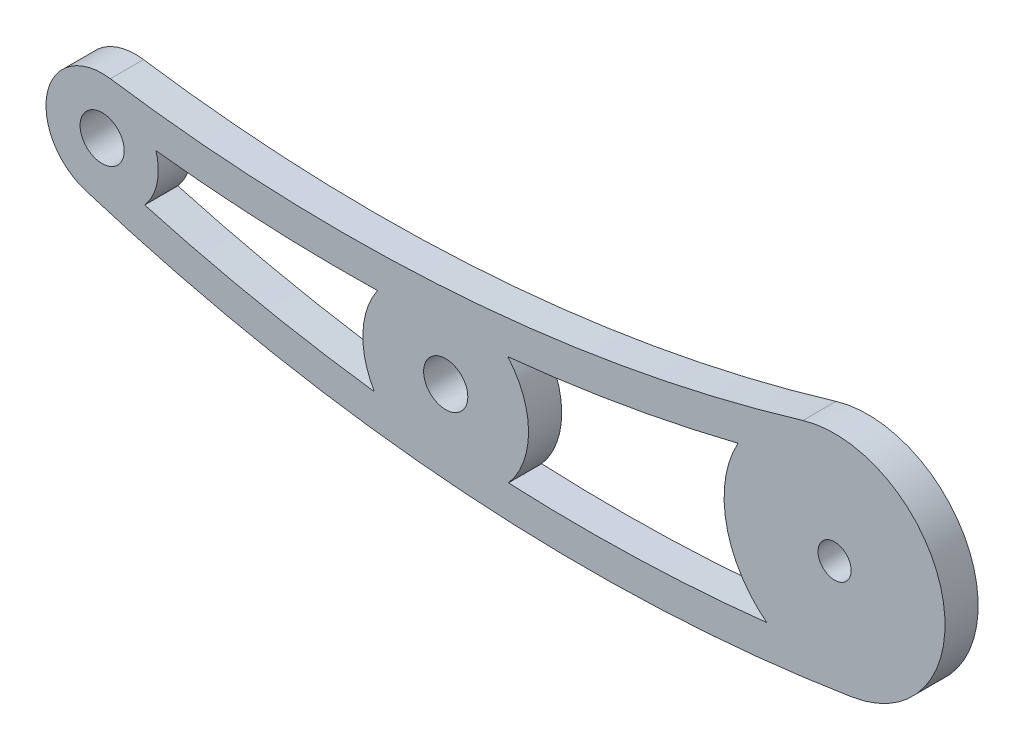
ISO-10303-21;
HEADER;
FILE_DESCRIPTION(('STEP AP214'),'2;1');
FILE_NAME('part.step','',(''),(''),'','','');
FILE_SCHEMA(('AUTOMOTIVE_DESIGN { 1 0 10303 214 1 1 1 1 }'));
ENDSEC;
DATA;
#1=APPLICATION_CONTEXT('core data for automotive mechanical design processes');
#2=APPLICATION_PROTOCOL_DEFINITION('international standard','automotive_design',2000,#1);
#3=PRODUCT_CONTEXT('',#1,'mechanical');
#4=PRODUCT('Part','Part','',(#3));
#5=PRODUCT_RELATED_PRODUCT_CATEGORY('part','',(#4));
#6=PRODUCT_DEFINITION_FORMATION('','',#4);
#7=PRODUCT_DEFINITION_CONTEXT('part definition',#1,'design');
#8=PRODUCT_DEFINITION('design','',#6,#7);
#9=PRODUCT_DEFINITION_SHAPE('','',#8);
#10=(LENGTH_UNIT() NAMED_UNIT(*) SI_UNIT(.MILLI.,.METRE.));
#11=(NAMED_UNIT(*) PLANE_ANGLE_UNIT() SI_UNIT($,.RADIAN.));
#12=(NAMED_UNIT(*) SI_UNIT($,.STERADIAN.) SOLID_ANGLE_UNIT());
#13=UNCERTAINTY_MEASURE_WITH_UNIT(LENGTH_MEASURE(1.E-05),#10,'distance_accuracy_value','');
#14=(GEOMETRIC_REPRESENTATION_CONTEXT(3) GLOBAL_UNCERTAINTY_ASSIGNED_CONTEXT((#13)) GLOBAL_UNIT_ASSIGNED_CONTEXT((#10,
#11,#12)) REPRESENTATION_CONTEXT('',''));
#15=CARTESIAN_POINT('',(0.,0.,0.));
#16=DIRECTION('',(0.,0.,1.));
#17=DIRECTION('',(1.,0.,0.));
#18=AXIS2_PLACEMENT_3D('',#15,#16,#17);
#19=CARTESIAN_POINT('',(33.1500000000001,-229.725921356237,-3.));
#20=DIRECTION('',(0.,0.,-1.));
#21=DIRECTION('',(1.,0.,0.));
#22=AXIS2_PLACEMENT_3D('',#19,#20,#21);
#23=PLANE('',#22);
#24=CARTESIAN_POINT('',(0.,0.,-3.));
#25=DIRECTION('',(0.,0.,1.));
#26=DIRECTION('',(1.,0.,0.));
#27=AXIS2_PLACEMENT_3D('',#24,#25,#26);
#28=CIRCLE('',#27,5.08347455034852);
#29=CARTESIAN_POINT('',(3.85218516838753,-3.3169840114924,-3.));
#30=VERTEX_POINT('',#29);
#31=CARTESIAN_POINT('',(4.86926369041746,1.46013171228597,-3.));
#32=VERTEX_POINT('',#31);
#33=EDGE_CURVE('E152',#30,#32,#28,.T.);
#34=ORIENTED_EDGE('',*,*,#33,.F.);
#35=CARTESIAN_POINT('',(43.806101944885,139.438004529346,-3.));
#36=DIRECTION('',(0.,0.,1.));
#37=DIRECTION('',(1.,0.,0.));
#38=AXIS2_PLACEMENT_3D('',#35,#36,#37);
#39=CIRCLE('',#38,148.240690159882);
#40=CARTESIAN_POINT('',(24.6452263393288,-7.5591487257649,-3.));
#41=VERTEX_POINT('',#40);
#42=EDGE_CURVE('E155',#30,#41,#39,.T.);
#43=ORIENTED_EDGE('',*,*,#42,.T.);
#44=CARTESIAN_POINT('',(31.1,-3.74,-3.));
#45=DIRECTION('',(0.,0.,1.));
#46=DIRECTION('',(1.,0.,0.));
#47=AXIS2_PLACEMENT_3D('',#44,#45,#46);
#48=CIRCLE('',#47,7.50000000000038);
#49=CARTESIAN_POINT('',(24.9211005926827,0.511023654869408,-3.));
#50=VERTEX_POINT('',#49);
#51=EDGE_CURVE('E158',#50,#41,#48,.T.);
#52=ORIENTED_EDGE('',*,*,#51,.F.);
#53=CARTESIAN_POINT('',(21.8615379379878,148.164003935193,-3.));
#54=DIRECTION('',(0.,0.,1.));
#55=DIRECTION('',(1.,0.,0.));
#56=AXIS2_PLACEMENT_3D('',#53,#54,#55);
#57=CIRCLE('',#56,147.684675946083);
#58=EDGE_CURVE('E147',#32,#50,#57,.T.);
#59=ORIENTED_EDGE('',*,*,#58,.F.);
#60=EDGE_LOOP('',(#34,#43,#52,#59));
#61=FACE_BOUND('',#60,.T.);
#62=CARTESIAN_POINT('',(0.,0.,-3.));
#63=DIRECTION('',(0.,0.,1.));
#64=DIRECTION('',(1.,0.,0.));
#65=AXIS2_PLACEMENT_3D('',#62,#63,#64);
#66=CIRCLE('',#65,5.08347455034873);
#67=CARTESIAN_POINT('',(0.742030741321678,5.02902613663687,-3.));
#68=VERTEX_POINT('',#67);
#69=CARTESIAN_POINT('',(-1.52361416751216,-4.84977456925589,-3.));
#70=VERTEX_POINT('',#69);
#71=EDGE_CURVE('E196',#68,#70,#66,.T.);
#72=ORIENTED_EDGE('',*,*,#71,.F.);
#73=CARTESIAN_POINT('',(21.8615379379878,148.164003935193,-3.));
#74=DIRECTION('',(0.,0.,1.));
#75=DIRECTION('',(1.,0.,0.));
#76=AXIS2_PLACEMENT_3D('',#73,#74,#75);
#77=CIRCLE('',#76,144.684675946083);
#78=CARTESIAN_POINT('',(63.4271580852972,9.57845391141634,-3.));
#79=VERTEX_POINT('',#78);
#80=EDGE_CURVE('E164',#68,#79,#77,.T.);
#81=ORIENTED_EDGE('',*,*,#80,.T.);
#82=CARTESIAN_POINT('',(66.3,0.,-3.));
#83=DIRECTION('',(0.,0.,1.));
#84=DIRECTION('',(1.,0.,0.));
#85=AXIS2_PLACEMENT_3D('',#82,#83,#84);
#86=CIRCLE('',#85,10.);
#87=CARTESIAN_POINT('',(67.8925933263036,-9.872367826262,-3.));
#88=VERTEX_POINT('',#87);
#89=EDGE_CURVE('E174',#88,#79,#86,.T.);
#90=ORIENTED_EDGE('',*,*,#89,.F.);
#91=CARTESIAN_POINT('',(43.806101944885,139.438004529346,-3.));
#92=DIRECTION('',(0.,0.,1.));
#93=DIRECTION('',(1.,0.,0.));
#94=AXIS2_PLACEMENT_3D('',#91,#92,#93);
#95=CIRCLE('',#94,151.240690159882);
#96=EDGE_CURVE('E183',#88,#70,#95,.F.);
#97=ORIENTED_EDGE('',*,*,#96,.T.);
#98=EDGE_LOOP('',(#72,#81,#90,#97));
#99=FACE_BOUND('',#98,.T.);
#100=CARTESIAN_POINT('',(31.1,-3.74,-3.));
#101=DIRECTION('',(0.,0.,1.));
#102=DIRECTION('',(1.,0.,0.));
#103=AXIS2_PLACEMENT_3D('',#100,#101,#102);
#104=CIRCLE('',#103,2.);
#105=CARTESIAN_POINT('',(33.1,-3.74,-3.));
#106=VERTEX_POINT('',#105);
#107=EDGE_CURVE('E199',#106,#106,#104,.T.);
#108=ORIENTED_EDGE('',*,*,#107,.T.);
#109=EDGE_LOOP('',(#108));
#110=FACE_BOUND('',#109,.T.);
#111=CARTESIAN_POINT('',(0.,0.,-3.));
#112=DIRECTION('',(0.,0.,1.));
#113=DIRECTION('',(1.,0.,0.));
#114=AXIS2_PLACEMENT_3D('',#111,#112,#113);
#115=CIRCLE('',#114,2.);
#116=CARTESIAN_POINT('',(2.,0.,-3.));
#117=VERTEX_POINT('',#116);
#118=EDGE_CURVE('E203',#117,#117,#115,.T.);
#119=ORIENTED_EDGE('',*,*,#118,.T.);
#120=EDGE_LOOP('',(#119));
#121=FACE_BOUND('',#120,.T.);
#122=CARTESIAN_POINT('',(66.3,0.,-3.));
#123=DIRECTION('',(0.,0.,1.));
#124=DIRECTION('',(1.,0.,0.));
#125=AXIS2_PLACEMENT_3D('',#122,#123,#124);
#126=CIRCLE('',#125,1.5);
#127=CARTESIAN_POINT('',(67.8,0.,-3.));
#128=VERTEX_POINT('',#127);
#129=EDGE_CURVE('E206',#128,#128,#126,.T.);
#130=ORIENTED_EDGE('',*,*,#129,.T.);
#131=EDGE_LOOP('',(#130));
#132=FACE_BOUND('',#131,.T.);
#133=CARTESIAN_POINT('',(43.806101944885,139.438004529346,-3.));
#134=DIRECTION('',(0.,0.,1.));
#135=DIRECTION('',(1.,0.,0.));
#136=AXIS2_PLACEMENT_3D('',#133,#134,#135);
#137=CIRCLE('',#136,148.240690159882);
#138=CARTESIAN_POINT('',(36.781348533757,-8.63614938885476,-3.));
#139=VERTEX_POINT('',#138);
#140=CARTESIAN_POINT('',(60.1653847937653,-7.89724611946679,-3.));
#141=VERTEX_POINT('',#140);
#142=EDGE_CURVE('E126',#139,#141,#137,.T.);
#143=ORIENTED_EDGE('',*,*,#142,.T.);
#144=CARTESIAN_POINT('',(66.3,0.,-3.));
#145=DIRECTION('',(0.,0.,1.));
#146=DIRECTION('',(1.,0.,0.));
#147=AXIS2_PLACEMENT_3D('',#144,#145,#146);
#148=CIRCLE('',#147,9.99999999999996);
#149=CARTESIAN_POINT('',(57.5596995290634,4.85871872799248,-3.));
#150=VERTEX_POINT('',#149);
#151=EDGE_CURVE('E133',#150,#141,#148,.T.);
#152=ORIENTED_EDGE('',*,*,#151,.F.);
#153=CARTESIAN_POINT('',(21.8615379379878,148.164003935193,-3.));
#154=DIRECTION('',(0.,0.,1.));
#155=DIRECTION('',(1.,0.,0.));
#156=AXIS2_PLACEMENT_3D('',#153,#154,#155);
#157=CIRCLE('',#156,147.684675946083);
#158=CARTESIAN_POINT('',(36.7181888125933,1.22849619764948,-3.));
#159=VERTEX_POINT('',#158);
#160=EDGE_CURVE('E138',#159,#150,#157,.T.);
#161=ORIENTED_EDGE('',*,*,#160,.F.);
#162=CARTESIAN_POINT('',(31.1,-3.74,-3.));
#163=DIRECTION('',(0.,0.,1.));
#164=DIRECTION('',(1.,0.,0.));
#165=AXIS2_PLACEMENT_3D('',#162,#163,#164);
#166=CIRCLE('',#165,7.50000000000039);
#167=EDGE_CURVE('E140',#139,#159,#166,.T.);
#168=ORIENTED_EDGE('',*,*,#167,.F.);
#169=EDGE_LOOP('',(#143,#152,#161,#168));
#170=FACE_BOUND('',#169,.T.);
#171=ADVANCED_FACE('F34',(#61,#99,#110,#121,#132,#170),#23,.T.);
#172=CARTESIAN_POINT('',(33.1500000000001,-229.725921356237,0.));
#173=DIRECTION('',(0.,0.,-1.));
#174=DIRECTION('',(1.,0.,0.));
#175=AXIS2_PLACEMENT_3D('',#172,#173,#174);
#176=PLANE('',#175);
#177=CARTESIAN_POINT('',(21.8615379379878,148.164003935193,0.));
#178=DIRECTION('',(0.,0.,1.));
#179=DIRECTION('',(1.,0.,0.));
#180=AXIS2_PLACEMENT_3D('',#177,#178,#179);
#181=CIRCLE('',#180,147.684675946083);
#182=CARTESIAN_POINT('',(4.86926369041746,1.46013171228597,0.));
#183=VERTEX_POINT('',#182);
#184=CARTESIAN_POINT('',(24.9211005926827,0.511023654869408,0.));
#185=VERTEX_POINT('',#184);
#186=EDGE_CURVE('E228',#183,#185,#181,.T.);
#187=ORIENTED_EDGE('',*,*,#186,.T.);
#188=CARTESIAN_POINT('',(31.1,-3.74,0.));
#189=DIRECTION('',(0.,0.,1.));
#190=DIRECTION('',(1.,0.,0.));
#191=AXIS2_PLACEMENT_3D('',#188,#189,#190);
#192=CIRCLE('',#191,7.50000000000038);
#193=CARTESIAN_POINT('',(24.6452263393288,-7.5591487257649,0.));
#194=VERTEX_POINT('',#193);
#195=EDGE_CURVE('E225',#185,#194,#192,.T.);
#196=ORIENTED_EDGE('',*,*,#195,.T.);
#197=CARTESIAN_POINT('',(43.806101944885,139.438004529346,0.));
#198=DIRECTION('',(0.,0.,1.));
#199=DIRECTION('',(1.,0.,0.));
#200=AXIS2_PLACEMENT_3D('',#197,#198,#199);
#201=CIRCLE('',#200,148.240690159882);
#202=CARTESIAN_POINT('',(3.85218516838753,-3.3169840114924,0.));
#203=VERTEX_POINT('',#202);
#204=EDGE_CURVE('E222',#203,#194,#201,.T.);
#205=ORIENTED_EDGE('',*,*,#204,.F.);
#206=CARTESIAN_POINT('',(0.,0.,0.));
#207=DIRECTION('',(0.,0.,1.));
#208=DIRECTION('',(1.,0.,0.));
#209=AXIS2_PLACEMENT_3D('',#206,#207,#208);
#210=CIRCLE('',#209,5.08347455034852);
#211=EDGE_CURVE('E209',#203,#183,#210,.T.);
#212=ORIENTED_EDGE('',*,*,#211,.T.);
#213=EDGE_LOOP('',(#187,#196,#205,#212));
#214=FACE_BOUND('',#213,.T.);
#215=CARTESIAN_POINT('',(43.806101944885,139.438004529346,0.));
#216=DIRECTION('',(0.,0.,1.));
#217=DIRECTION('',(1.,0.,0.));
#218=AXIS2_PLACEMENT_3D('',#215,#216,#217);
#219=CIRCLE('',#218,151.240690159882);
#220=CARTESIAN_POINT('',(67.8925933263036,-9.872367826262,0.));
#221=VERTEX_POINT('',#220);
#222=CARTESIAN_POINT('',(-1.52361416751216,-4.84977456925589,0.));
#223=VERTEX_POINT('',#222);
#224=EDGE_CURVE('E173',#221,#223,#219,.F.);
#225=ORIENTED_EDGE('',*,*,#224,.F.);
#226=CARTESIAN_POINT('',(66.3,0.,0.));
#227=DIRECTION('',(0.,0.,1.));
#228=DIRECTION('',(1.,0.,0.));
#229=AXIS2_PLACEMENT_3D('',#226,#227,#228);
#230=CIRCLE('',#229,10.);
#231=CARTESIAN_POINT('',(63.4271580852972,9.57845391141634,0.));
#232=VERTEX_POINT('',#231);
#233=EDGE_CURVE('E177',#221,#232,#230,.T.);
#234=ORIENTED_EDGE('',*,*,#233,.T.);
#235=CARTESIAN_POINT('',(21.8615379379878,148.164003935193,0.));
#236=DIRECTION('',(0.,0.,1.));
#237=DIRECTION('',(1.,0.,0.));
#238=AXIS2_PLACEMENT_3D('',#235,#236,#237);
#239=CIRCLE('',#238,144.684675946083);
#240=CARTESIAN_POINT('',(0.742030741321678,5.02902613663687,0.));
#241=VERTEX_POINT('',#240);
#242=EDGE_CURVE('E170',#241,#232,#239,.T.);
#243=ORIENTED_EDGE('',*,*,#242,.F.);
#244=CARTESIAN_POINT('',(0.,0.,0.));
#245=DIRECTION('',(0.,0.,1.));
#246=DIRECTION('',(1.,0.,0.));
#247=AXIS2_PLACEMENT_3D('',#244,#245,#246);
#248=CIRCLE('',#247,5.08347455034873);
#249=EDGE_CURVE('E190',#241,#223,#248,.T.);
#250=ORIENTED_EDGE('',*,*,#249,.T.);
#251=EDGE_LOOP('',(#225,#234,#243,#250));
#252=FACE_BOUND('',#251,.T.);
#253=CARTESIAN_POINT('',(31.1,-3.74,0.));
#254=DIRECTION('',(0.,0.,1.));
#255=DIRECTION('',(1.,0.,0.));
#256=AXIS2_PLACEMENT_3D('',#253,#254,#255);
#257=CIRCLE('',#256,2.);
#258=CARTESIAN_POINT('',(33.1,-3.74,0.));
#259=VERTEX_POINT('',#258);
#260=EDGE_CURVE('E212',#259,#259,#257,.T.);
#261=ORIENTED_EDGE('',*,*,#260,.F.);
#262=EDGE_LOOP('',(#261));
#263=FACE_BOUND('',#262,.T.);
#264=CARTESIAN_POINT('',(0.,0.,0.));
#265=DIRECTION('',(0.,0.,1.));
#266=DIRECTION('',(1.,0.,0.));
#267=AXIS2_PLACEMENT_3D('',#264,#265,#266);
#268=CIRCLE('',#267,2.);
#269=CARTESIAN_POINT('',(2.,0.,0.));
#270=VERTEX_POINT('',#269);
#271=EDGE_CURVE('E215',#270,#270,#268,.T.);
#272=ORIENTED_EDGE('',*,*,#271,.F.);
#273=EDGE_LOOP('',(#272));
#274=FACE_BOUND('',#273,.T.);
#275=CARTESIAN_POINT('',(66.3,0.,0.));
#276=DIRECTION('',(0.,0.,1.));
#277=DIRECTION('',(1.,0.,0.));
#278=AXIS2_PLACEMENT_3D('',#275,#276,#277);
#279=CIRCLE('',#278,1.5);
#280=CARTESIAN_POINT('',(67.8,0.,0.));
#281=VERTEX_POINT('',#280);
#282=EDGE_CURVE('E200',#281,#281,#279,.T.);
#283=ORIENTED_EDGE('',*,*,#282,.F.);
#284=EDGE_LOOP('',(#283));
#285=FACE_BOUND('',#284,.T.);
#286=CARTESIAN_POINT('',(31.1,-3.74,0.));
#287=DIRECTION('',(0.,0.,1.));
#288=DIRECTION('',(1.,0.,0.));
#289=AXIS2_PLACEMENT_3D('',#286,#287,#288);
#290=CIRCLE('',#289,7.50000000000039);
#291=CARTESIAN_POINT('',(36.781348533757,-8.63614938885476,0.));
#292=VERTEX_POINT('',#291);
#293=CARTESIAN_POINT('',(36.7181888125933,1.22849619764948,0.));
#294=VERTEX_POINT('',#293);
#295=EDGE_CURVE('E11',#292,#294,#290,.T.);
#296=ORIENTED_EDGE('',*,*,#295,.T.);
#297=CARTESIAN_POINT('',(21.8615379379878,148.164003935193,0.));
#298=DIRECTION('',(0.,0.,1.));
#299=DIRECTION('',(1.,0.,0.));
#300=AXIS2_PLACEMENT_3D('',#297,#298,#299);
#301=CIRCLE('',#300,147.684675946083);
#302=CARTESIAN_POINT('',(57.5596995290634,4.85871872799248,0.));
#303=VERTEX_POINT('',#302);
#304=EDGE_CURVE('E42',#294,#303,#301,.T.);
#305=ORIENTED_EDGE('',*,*,#304,.T.);
#306=CARTESIAN_POINT('',(66.3,0.,0.));
#307=DIRECTION('',(0.,0.,1.));
#308=DIRECTION('',(1.,0.,0.));
#309=AXIS2_PLACEMENT_3D('',#306,#307,#308);
#310=CIRCLE('',#309,9.99999999999996);
#311=CARTESIAN_POINT('',(60.1653847937653,-7.89724611946679,0.));
#312=VERTEX_POINT('',#311);
#313=EDGE_CURVE('E232',#303,#312,#310,.T.);
#314=ORIENTED_EDGE('',*,*,#313,.T.);
#315=CARTESIAN_POINT('',(43.806101944885,139.438004529346,0.));
#316=DIRECTION('',(0.,0.,1.));
#317=DIRECTION('',(1.,0.,0.));
#318=AXIS2_PLACEMENT_3D('',#315,#316,#317);
#319=CIRCLE('',#318,148.240690159882);
#320=EDGE_CURVE('E128',#292,#312,#319,.T.);
#321=ORIENTED_EDGE('',*,*,#320,.F.);
#322=EDGE_LOOP('',(#296,#305,#314,#321));
#323=FACE_BOUND('',#322,.T.);
#324=ADVANCED_FACE('F236',(#214,#252,#263,#274,#285,#323),#176,.F.);
#325=CARTESIAN_POINT('',(0.,0.,-3.));
#326=DIRECTION('',(0.,0.,1.));
#327=DIRECTION('',(-1.,0.,0.));
#328=AXIS2_PLACEMENT_3D('',#325,#326,#327);
#329=CYLINDRICAL_SURFACE('',#328,5.08347455034873);
#330=DIRECTION('',(0.,0.,-1.));
#331=VECTOR('',#330,1.);
#332=CARTESIAN_POINT('',(0.742030741321678,5.02902613663687,0.));
#333=LINE('',#332,#331);
#334=EDGE_CURVE('E180',#241,#68,#333,.T.);
#335=ORIENTED_EDGE('',*,*,#334,.T.);
#336=ORIENTED_EDGE('',*,*,#71,.T.);
#337=DIRECTION('',(0.,0.,-1.));
#338=VECTOR('',#337,1.);
#339=CARTESIAN_POINT('',(-1.52361416751216,-4.84977456925589,0.));
#340=LINE('',#339,#338);
#341=EDGE_CURVE('E193',#223,#70,#340,.T.);
#342=ORIENTED_EDGE('',*,*,#341,.F.);
#343=ORIENTED_EDGE('',*,*,#249,.F.);
#344=EDGE_LOOP('',(#335,#336,#342,#343));
#345=FACE_BOUND('',#344,.T.);
#346=ADVANCED_FACE('F36',(#345),#329,.T.);
#347=CARTESIAN_POINT('',(0.,0.,-3.));
#348=DIRECTION('',(0.,0.,1.));
#349=DIRECTION('',(-1.,0.,0.));
#350=AXIS2_PLACEMENT_3D('',#347,#348,#349);
#351=CYLINDRICAL_SURFACE('',#350,2.);
#352=ORIENTED_EDGE('',*,*,#118,.F.);
#353=EDGE_LOOP('',(#352));
#354=FACE_BOUND('',#353,.T.);
#355=ORIENTED_EDGE('',*,*,#271,.T.);
#356=EDGE_LOOP('',(#355));
#357=FACE_BOUND('',#356,.T.);
#358=ADVANCED_FACE('F272',(#354,#357),#351,.F.);
#359=CARTESIAN_POINT('',(31.1,-3.74,-3.));
#360=DIRECTION('',(0.,0.,1.));
#361=DIRECTION('',(-1.,0.,0.));
#362=AXIS2_PLACEMENT_3D('',#359,#360,#361);
#363=CYLINDRICAL_SURFACE('',#362,2.);
#364=ORIENTED_EDGE('',*,*,#107,.F.);
#365=EDGE_LOOP('',(#364));
#366=FACE_BOUND('',#365,.T.);
#367=ORIENTED_EDGE('',*,*,#260,.T.);
#368=EDGE_LOOP('',(#367));
#369=FACE_BOUND('',#368,.T.);
#370=ADVANCED_FACE('F270',(#366,#369),#363,.F.);
#371=CARTESIAN_POINT('',(66.3,0.,-3.));
#372=DIRECTION('',(0.,0.,1.));
#373=DIRECTION('',(-1.,0.,0.));
#374=AXIS2_PLACEMENT_3D('',#371,#372,#373);
#375=CYLINDRICAL_SURFACE('',#374,1.5);
#376=ORIENTED_EDGE('',*,*,#129,.F.);
#377=EDGE_LOOP('',(#376));
#378=FACE_BOUND('',#377,.T.);
#379=ORIENTED_EDGE('',*,*,#282,.T.);
#380=EDGE_LOOP('',(#379));
#381=FACE_BOUND('',#380,.T.);
#382=ADVANCED_FACE('F267',(#378,#381),#375,.F.);
#383=CARTESIAN_POINT('',(21.8615379379878,148.164003935193,0.));
#384=DIRECTION('',(0.,0.,-1.));
#385=DIRECTION('',(1.,0.,0.));
#386=AXIS2_PLACEMENT_3D('',#383,#384,#385);
#387=CYLINDRICAL_SURFACE('',#386,144.684675946083);
#388=ORIENTED_EDGE('',*,*,#80,.F.);
#389=ORIENTED_EDGE('',*,*,#334,.F.);
#390=ORIENTED_EDGE('',*,*,#242,.T.);
#391=DIRECTION('',(0.,0.,-1.));
#392=VECTOR('',#391,1.);
#393=CARTESIAN_POINT('',(63.4271580852972,9.57845391141634,0.));
#394=LINE('',#393,#392);
#395=EDGE_CURVE('E188',#232,#79,#394,.T.);
#396=ORIENTED_EDGE('',*,*,#395,.T.);
#397=EDGE_LOOP('',(#388,#389,#390,#396));
#398=FACE_BOUND('',#397,.T.);
#399=ADVANCED_FACE('F264',(#398),#387,.F.);
#400=CARTESIAN_POINT('',(66.3,0.,0.));
#401=DIRECTION('',(0.,0.,-1.));
#402=DIRECTION('',(1.,0.,0.));
#403=AXIS2_PLACEMENT_3D('',#400,#401,#402);
#404=CYLINDRICAL_SURFACE('',#403,10.);
#405=ORIENTED_EDGE('',*,*,#89,.T.);
#406=ORIENTED_EDGE('',*,*,#395,.F.);
#407=ORIENTED_EDGE('',*,*,#233,.F.);
#408=DIRECTION('',(0.,0.,-1.));
#409=VECTOR('',#408,1.);
#410=CARTESIAN_POINT('',(67.8925933263036,-9.872367826262,0.));
#411=LINE('',#410,#409);
#412=EDGE_CURVE('E191',#221,#88,#411,.T.);
#413=ORIENTED_EDGE('',*,*,#412,.T.);
#414=EDGE_LOOP('',(#405,#406,#407,#413));
#415=FACE_BOUND('',#414,.T.);
#416=ADVANCED_FACE('F307',(#415),#404,.T.);
#417=CARTESIAN_POINT('',(43.806101944885,139.438004529346,0.));
#418=DIRECTION('',(0.,0.,-1.));
#419=DIRECTION('',(1.,0.,0.));
#420=AXIS2_PLACEMENT_3D('',#417,#418,#419);
#421=CYLINDRICAL_SURFACE('',#420,151.240690159882);
#422=ORIENTED_EDGE('',*,*,#96,.F.);
#423=ORIENTED_EDGE('',*,*,#412,.F.);
#424=ORIENTED_EDGE('',*,*,#224,.T.);
#425=ORIENTED_EDGE('',*,*,#341,.T.);
#426=EDGE_LOOP('',(#422,#423,#424,#425));
#427=FACE_BOUND('',#426,.T.);
#428=ADVANCED_FACE('F314',(#427),#421,.T.);
#429=CARTESIAN_POINT('',(21.8615379379878,148.164003935193,2.));
#430=DIRECTION('',(0.,0.,-1.));
#431=DIRECTION('',(1.,0.,0.));
#432=AXIS2_PLACEMENT_3D('',#429,#430,#431);
#433=CYLINDRICAL_SURFACE('',#432,147.684675946083);
#434=ORIENTED_EDGE('',*,*,#186,.F.);
#435=DIRECTION('',(0.,0.,-1.));
#436=VECTOR('',#435,1.);
#437=CARTESIAN_POINT('',(4.86926369041746,1.46013171228597,2.));
#438=LINE('',#437,#436);
#439=EDGE_CURVE('E161',#183,#32,#438,.T.);
#440=ORIENTED_EDGE('',*,*,#439,.T.);
#441=ORIENTED_EDGE('',*,*,#58,.T.);
#442=DIRECTION('',(0.,0.,-1.));
#443=VECTOR('',#442,1.);
#444=CARTESIAN_POINT('',(24.9211005926827,0.511023654869408,2.));
#445=LINE('',#444,#443);
#446=EDGE_CURVE('E162',#185,#50,#445,.T.);
#447=ORIENTED_EDGE('',*,*,#446,.F.);
#448=EDGE_LOOP('',(#434,#440,#441,#447));
#449=FACE_BOUND('',#448,.T.);
#450=ADVANCED_FACE('F322',(#449),#433,.T.);
#451=CARTESIAN_POINT('',(31.1,-3.74,2.));
#452=DIRECTION('',(0.,0.,-1.));
#453=DIRECTION('',(1.,0.,0.));
#454=AXIS2_PLACEMENT_3D('',#451,#452,#453);
#455=CYLINDRICAL_SURFACE('',#454,7.50000000000038);
#456=ORIENTED_EDGE('',*,*,#195,.F.);
#457=ORIENTED_EDGE('',*,*,#446,.T.);
#458=ORIENTED_EDGE('',*,*,#51,.T.);
#459=DIRECTION('',(0.,0.,-1.));
#460=VECTOR('',#459,1.);
#461=CARTESIAN_POINT('',(24.6452263393288,-7.5591487257649,2.));
#462=LINE('',#461,#460);
#463=EDGE_CURVE('E165',#194,#41,#462,.T.);
#464=ORIENTED_EDGE('',*,*,#463,.F.);
#465=EDGE_LOOP('',(#456,#457,#458,#464));
#466=FACE_BOUND('',#465,.T.);
#467=ADVANCED_FACE('F329',(#466),#455,.T.);
#468=CARTESIAN_POINT('',(43.806101944885,139.438004529346,2.));
#469=DIRECTION('',(0.,0.,-1.));
#470=DIRECTION('',(1.,0.,0.));
#471=AXIS2_PLACEMENT_3D('',#468,#469,#470);
#472=CYLINDRICAL_SURFACE('',#471,148.240690159882);
#473=DIRECTION('',(0.,0.,-1.));
#474=VECTOR('',#473,1.);
#475=CARTESIAN_POINT('',(3.85218516838753,-3.3169840114924,2.));
#476=LINE('',#475,#474);
#477=EDGE_CURVE('E167',#203,#30,#476,.T.);
#478=ORIENTED_EDGE('',*,*,#477,.F.);
#479=ORIENTED_EDGE('',*,*,#204,.T.);
#480=ORIENTED_EDGE('',*,*,#463,.T.);
#481=ORIENTED_EDGE('',*,*,#42,.F.);
#482=EDGE_LOOP('',(#478,#479,#480,#481));
#483=FACE_BOUND('',#482,.T.);
#484=ADVANCED_FACE('F248',(#483),#472,.F.);
#485=CARTESIAN_POINT('',(0.,0.,2.));
#486=DIRECTION('',(0.,0.,-1.));
#487=DIRECTION('',(1.,0.,0.));
#488=AXIS2_PLACEMENT_3D('',#485,#486,#487);
#489=CYLINDRICAL_SURFACE('',#488,5.08347455034852);
#490=ORIENTED_EDGE('',*,*,#211,.F.);
#491=ORIENTED_EDGE('',*,*,#477,.T.);
#492=ORIENTED_EDGE('',*,*,#33,.T.);
#493=ORIENTED_EDGE('',*,*,#439,.F.);
#494=EDGE_LOOP('',(#490,#491,#492,#493));
#495=FACE_BOUND('',#494,.T.);
#496=ADVANCED_FACE('F241',(#495),#489,.T.);
#497=CARTESIAN_POINT('',(31.1,-3.74,2.));
#498=DIRECTION('',(0.,0.,-1.));
#499=DIRECTION('',(1.,0.,0.));
#500=AXIS2_PLACEMENT_3D('',#497,#498,#499);
#501=CYLINDRICAL_SURFACE('',#500,7.50000000000039);
#502=ORIENTED_EDGE('',*,*,#295,.F.);
#503=DIRECTION('',(0.,0.,-1.));
#504=VECTOR('',#503,1.);
#505=CARTESIAN_POINT('',(36.781348533757,-8.63614938885476,2.));
#506=LINE('',#505,#504);
#507=EDGE_CURVE('E49',#292,#139,#506,.T.);
#508=ORIENTED_EDGE('',*,*,#507,.T.);
#509=ORIENTED_EDGE('',*,*,#167,.T.);
#510=DIRECTION('',(0.,0.,-1.));
#511=VECTOR('',#510,1.);
#512=CARTESIAN_POINT('',(36.7181888125933,1.22849619764948,2.));
#513=LINE('',#512,#511);
#514=EDGE_CURVE('E145',#294,#159,#513,.T.);
#515=ORIENTED_EDGE('',*,*,#514,.F.);
#516=EDGE_LOOP('',(#502,#508,#509,#515));
#517=FACE_BOUND('',#516,.T.);
#518=ADVANCED_FACE('F239',(#517),#501,.T.);
#519=CARTESIAN_POINT('',(21.8615379379878,148.164003935193,2.));
#520=DIRECTION('',(0.,0.,-1.));
#521=DIRECTION('',(1.,0.,0.));
#522=AXIS2_PLACEMENT_3D('',#519,#520,#521);
#523=CYLINDRICAL_SURFACE('',#522,147.684675946083);
#524=ORIENTED_EDGE('',*,*,#304,.F.);
#525=ORIENTED_EDGE('',*,*,#514,.T.);
#526=ORIENTED_EDGE('',*,*,#160,.T.);
#527=DIRECTION('',(0.,0.,-1.));
#528=VECTOR('',#527,1.);
#529=CARTESIAN_POINT('',(57.5596995290634,4.85871872799248,2.));
#530=LINE('',#529,#528);
#531=EDGE_CURVE('E130',#303,#150,#530,.T.);
#532=ORIENTED_EDGE('',*,*,#531,.F.);
#533=EDGE_LOOP('',(#524,#525,#526,#532));
#534=FACE_BOUND('',#533,.T.);
#535=ADVANCED_FACE('F238',(#534),#523,.T.);
#536=CARTESIAN_POINT('',(66.3,0.,2.));
#537=DIRECTION('',(0.,0.,-1.));
#538=DIRECTION('',(1.,0.,0.));
#539=AXIS2_PLACEMENT_3D('',#536,#537,#538);
#540=CYLINDRICAL_SURFACE('',#539,9.99999999999996);
#541=ORIENTED_EDGE('',*,*,#313,.F.);
#542=ORIENTED_EDGE('',*,*,#531,.T.);
#543=ORIENTED_EDGE('',*,*,#151,.T.);
#544=DIRECTION('',(0.,0.,-1.));
#545=VECTOR('',#544,1.);
#546=CARTESIAN_POINT('',(60.1653847937653,-7.89724611946679,2.));
#547=LINE('',#546,#545);
#548=EDGE_CURVE('E57',#312,#141,#547,.T.);
#549=ORIENTED_EDGE('',*,*,#548,.F.);
#550=EDGE_LOOP('',(#541,#542,#543,#549));
#551=FACE_BOUND('',#550,.T.);
#552=ADVANCED_FACE('F134',(#551),#540,.T.);
#553=CARTESIAN_POINT('',(43.806101944885,139.438004529346,2.));
#554=DIRECTION('',(0.,0.,-1.));
#555=DIRECTION('',(1.,0.,0.));
#556=AXIS2_PLACEMENT_3D('',#553,#554,#555);
#557=CYLINDRICAL_SURFACE('',#556,148.240690159882);
#558=ORIENTED_EDGE('',*,*,#507,.F.);
#559=ORIENTED_EDGE('',*,*,#320,.T.);
#560=ORIENTED_EDGE('',*,*,#548,.T.);
#561=ORIENTED_EDGE('',*,*,#142,.F.);
#562=EDGE_LOOP('',(#558,#559,#560,#561));
#563=FACE_BOUND('',#562,.T.);
#564=ADVANCED_FACE('F124',(#563),#557,.F.);
#565=CLOSED_SHELL('',(#171,#324,#346,#358,#370,#382,#399,#416,#428,#450,#467,#484,#496,#518,
#535,#552,#564));
#566=MANIFOLD_SOLID_BREP('B2',#565);
#567=ADVANCED_BREP_SHAPE_REPRESENTATION('',(#18,#566),#14);
#568=SHAPE_DEFINITION_REPRESENTATION(#9,#567);
ENDSEC;
END-ISO-10303-21;
